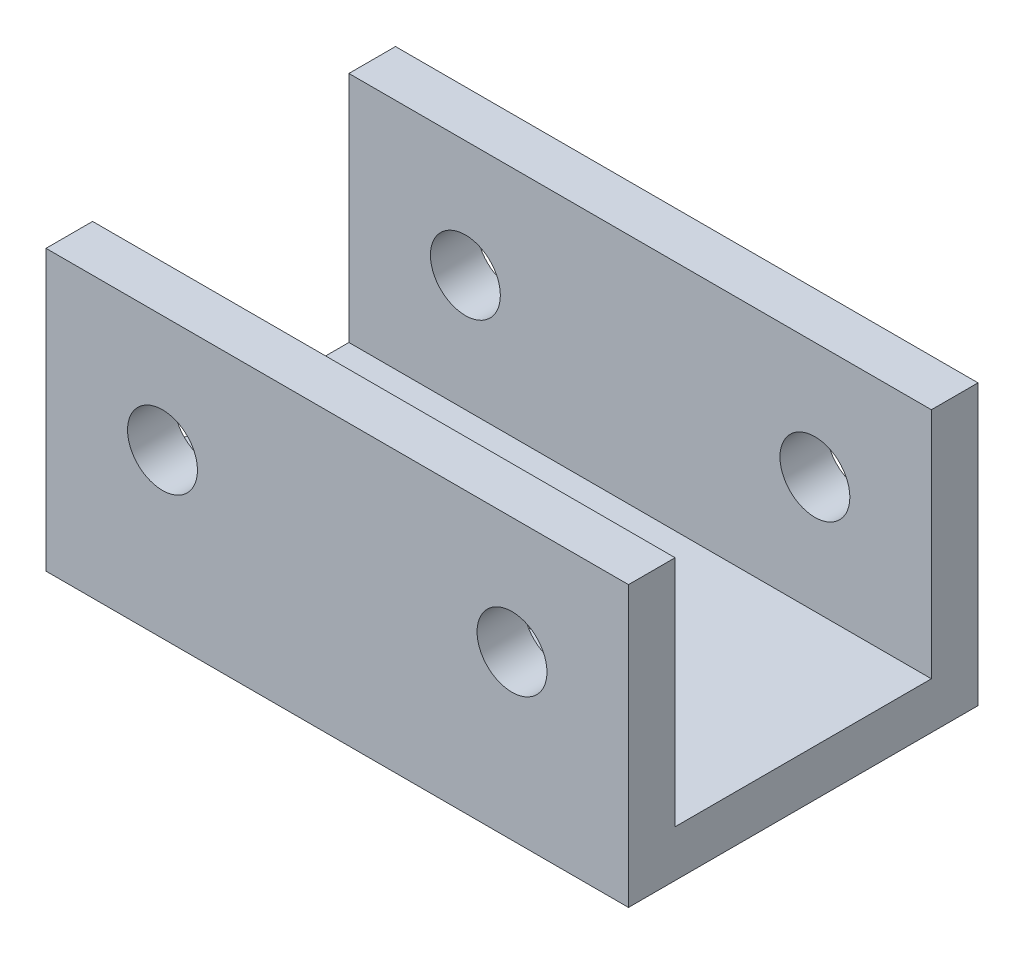
ISO-10303-21;
HEADER;
FILE_DESCRIPTION(('STEP AP214'),'2;1');
FILE_NAME('part.step','',(''),(''),'','','');
FILE_SCHEMA(('AUTOMOTIVE_DESIGN { 1 0 10303 214 1 1 1 1 }'));
ENDSEC;
DATA;
#1=APPLICATION_CONTEXT('core data for automotive mechanical design processes');
#2=APPLICATION_PROTOCOL_DEFINITION('international standard','automotive_design',2000,#1);
#3=PRODUCT_CONTEXT('',#1,'mechanical');
#4=PRODUCT('Part','Part','',(#3));
#5=PRODUCT_RELATED_PRODUCT_CATEGORY('part','',(#4));
#6=PRODUCT_DEFINITION_FORMATION('','',#4);
#7=PRODUCT_DEFINITION_CONTEXT('part definition',#1,'design');
#8=PRODUCT_DEFINITION('design','',#6,#7);
#9=PRODUCT_DEFINITION_SHAPE('','',#8);
#10=(LENGTH_UNIT() NAMED_UNIT(*) SI_UNIT(.MILLI.,.METRE.));
#11=(NAMED_UNIT(*) PLANE_ANGLE_UNIT() SI_UNIT($,.RADIAN.));
#12=(NAMED_UNIT(*) SI_UNIT($,.STERADIAN.) SOLID_ANGLE_UNIT());
#13=UNCERTAINTY_MEASURE_WITH_UNIT(LENGTH_MEASURE(1.E-05),#10,'distance_accuracy_value','');
#14=(GEOMETRIC_REPRESENTATION_CONTEXT(3) GLOBAL_UNCERTAINTY_ASSIGNED_CONTEXT((#13)) GLOBAL_UNIT_ASSIGNED_CONTEXT((#10,
#11,#12)) REPRESENTATION_CONTEXT('',''));
#15=CARTESIAN_POINT('',(0.,0.,0.));
#16=DIRECTION('',(0.,0.,1.));
#17=DIRECTION('',(1.,0.,0.));
#18=AXIS2_PLACEMENT_3D('',#15,#16,#17);
#19=CARTESIAN_POINT('',(0.,0.,0.));
#20=DIRECTION('',(0.,-1.,0.));
#21=DIRECTION('',(0.,0.,-1.));
#22=AXIS2_PLACEMENT_3D('',#19,#20,#21);
#23=PLANE('',#22);
#24=DIRECTION('',(0.,0.,1.));
#25=VECTOR('',#24,1.);
#26=CARTESIAN_POINT('',(-50.,0.,30.));
#27=LINE('',#26,#25);
#28=CARTESIAN_POINT('',(-50.,0.,-30.));
#29=VERTEX_POINT('',#28);
#30=CARTESIAN_POINT('',(-50.,0.,30.));
#31=VERTEX_POINT('',#30);
#32=EDGE_CURVE('E212',#29,#31,#27,.T.);
#33=ORIENTED_EDGE('',*,*,#32,.F.);
#34=DIRECTION('',(-1.,0.,0.));
#35=VECTOR('',#34,1.);
#36=CARTESIAN_POINT('',(-50.,0.,-30.));
#37=LINE('',#36,#35);
#38=CARTESIAN_POINT('',(50.,0.,-30.));
#39=VERTEX_POINT('',#38);
#40=EDGE_CURVE('E239',#39,#29,#37,.T.);
#41=ORIENTED_EDGE('',*,*,#40,.F.);
#42=DIRECTION('',(0.,0.,-1.));
#43=VECTOR('',#42,1.);
#44=CARTESIAN_POINT('',(50.,0.,-30.));
#45=LINE('',#44,#43);
#46=CARTESIAN_POINT('',(50.,0.,30.));
#47=VERTEX_POINT('',#46);
#48=EDGE_CURVE('E236',#47,#39,#45,.T.);
#49=ORIENTED_EDGE('',*,*,#48,.F.);
#50=DIRECTION('',(1.,0.,0.));
#51=VECTOR('',#50,1.);
#52=CARTESIAN_POINT('',(50.,0.,30.));
#53=LINE('',#52,#51);
#54=EDGE_CURVE('E233',#31,#47,#53,.T.);
#55=ORIENTED_EDGE('',*,*,#54,.F.);
#56=EDGE_LOOP('',(#33,#41,#49,#55));
#57=FACE_BOUND('',#56,.T.);
#58=DIRECTION('',(-1.,0.,0.));
#59=VECTOR('',#58,1.);
#60=CARTESIAN_POINT('',(-15.,0.,-5.));
#61=LINE('',#60,#59);
#62=CARTESIAN_POINT('',(15.,0.,-5.));
#63=VERTEX_POINT('',#62);
#64=CARTESIAN_POINT('',(-15.,0.,-5.));
#65=VERTEX_POINT('',#64);
#66=EDGE_CURVE('E163',#63,#65,#61,.T.);
#67=ORIENTED_EDGE('',*,*,#66,.T.);
#68=CARTESIAN_POINT('',(-15.,0.,0.));
#69=DIRECTION('',(0.,1.,0.));
#70=DIRECTION('',(0.,0.,-1.));
#71=AXIS2_PLACEMENT_3D('',#68,#69,#70);
#72=CIRCLE('',#71,5.);
#73=CARTESIAN_POINT('',(-15.,0.,5.));
#74=VERTEX_POINT('',#73);
#75=EDGE_CURVE('E70',#65,#74,#72,.T.);
#76=ORIENTED_EDGE('',*,*,#75,.T.);
#77=DIRECTION('',(1.,0.,0.));
#78=VECTOR('',#77,1.);
#79=CARTESIAN_POINT('',(15.,0.,5.));
#80=LINE('',#79,#78);
#81=CARTESIAN_POINT('',(15.,0.,5.));
#82=VERTEX_POINT('',#81);
#83=EDGE_CURVE('E153',#74,#82,#80,.T.);
#84=ORIENTED_EDGE('',*,*,#83,.T.);
#85=CARTESIAN_POINT('',(15.,0.,0.));
#86=DIRECTION('',(0.,1.,0.));
#87=DIRECTION('',(0.,0.,-1.));
#88=AXIS2_PLACEMENT_3D('',#85,#86,#87);
#89=CIRCLE('',#88,5.);
#90=EDGE_CURVE('E160',#82,#63,#89,.T.);
#91=ORIENTED_EDGE('',*,*,#90,.T.);
#92=EDGE_LOOP('',(#67,#76,#84,#91));
#93=FACE_BOUND('',#92,.T.);
#94=ADVANCED_FACE('F51',(#57,#93),#23,.T.);
#95=CARTESIAN_POINT('',(0.,8.,0.));
#96=DIRECTION('',(0.,-1.,0.));
#97=DIRECTION('',(0.,0.,-1.));
#98=AXIS2_PLACEMENT_3D('',#95,#96,#97);
#99=PLANE('',#98);
#100=DIRECTION('',(1.,0.,0.));
#101=VECTOR('',#100,1.);
#102=CARTESIAN_POINT('',(52.,8.,22.));
#103=LINE('',#102,#101);
#104=CARTESIAN_POINT('',(-50.,8.,22.));
#105=VERTEX_POINT('',#104);
#106=CARTESIAN_POINT('',(50.,8.,22.));
#107=VERTEX_POINT('',#106);
#108=EDGE_CURVE('E149',#105,#107,#103,.T.);
#109=ORIENTED_EDGE('',*,*,#108,.T.);
#110=DIRECTION('',(0.,0.,1.));
#111=VECTOR('',#110,1.);
#112=CARTESIAN_POINT('',(50.,8.,-30.));
#113=LINE('',#112,#111);
#114=CARTESIAN_POINT('',(50.,8.,-22.));
#115=VERTEX_POINT('',#114);
#116=EDGE_CURVE('E265',#115,#107,#113,.T.);
#117=ORIENTED_EDGE('',*,*,#116,.F.);
#118=DIRECTION('',(-1.,0.,0.));
#119=VECTOR('',#118,1.);
#120=CARTESIAN_POINT('',(-52.,8.,-22.));
#121=LINE('',#120,#119);
#122=CARTESIAN_POINT('',(-50.,8.,-22.));
#123=VERTEX_POINT('',#122);
#124=EDGE_CURVE('E188',#115,#123,#121,.T.);
#125=ORIENTED_EDGE('',*,*,#124,.T.);
#126=DIRECTION('',(0.,0.,-1.));
#127=VECTOR('',#126,1.);
#128=CARTESIAN_POINT('',(-50.,8.,30.));
#129=LINE('',#128,#127);
#130=EDGE_CURVE('E208',#105,#123,#129,.T.);
#131=ORIENTED_EDGE('',*,*,#130,.F.);
#132=EDGE_LOOP('',(#109,#117,#125,#131));
#133=FACE_BOUND('',#132,.T.);
#134=CARTESIAN_POINT('',(-15.,8.,0.));
#135=DIRECTION('',(0.,-1.,0.));
#136=DIRECTION('',(0.,0.,-1.));
#137=AXIS2_PLACEMENT_3D('',#134,#135,#136);
#138=CIRCLE('',#137,5.);
#139=CARTESIAN_POINT('',(-15.,8.,-5.));
#140=VERTEX_POINT('',#139);
#141=CARTESIAN_POINT('',(-15.,8.,5.));
#142=VERTEX_POINT('',#141);
#143=EDGE_CURVE('E11',#140,#142,#138,.F.);
#144=ORIENTED_EDGE('',*,*,#143,.F.);
#145=DIRECTION('',(-1.,0.,0.));
#146=VECTOR('',#145,1.);
#147=CARTESIAN_POINT('',(0.,8.,-5.));
#148=LINE('',#147,#146);
#149=CARTESIAN_POINT('',(15.,8.,-5.));
#150=VERTEX_POINT('',#149);
#151=EDGE_CURVE('E269',#150,#140,#148,.T.);
#152=ORIENTED_EDGE('',*,*,#151,.F.);
#153=CARTESIAN_POINT('',(15.,8.,0.));
#154=DIRECTION('',(0.,-1.,0.));
#155=DIRECTION('',(0.,0.,-1.));
#156=AXIS2_PLACEMENT_3D('',#153,#154,#155);
#157=CIRCLE('',#156,5.);
#158=CARTESIAN_POINT('',(15.,8.,5.));
#159=VERTEX_POINT('',#158);
#160=EDGE_CURVE('E271',#159,#150,#157,.F.);
#161=ORIENTED_EDGE('',*,*,#160,.F.);
#162=DIRECTION('',(1.,0.,0.));
#163=VECTOR('',#162,1.);
#164=CARTESIAN_POINT('',(0.,8.,5.));
#165=LINE('',#164,#163);
#166=EDGE_CURVE('E62',#142,#159,#165,.T.);
#167=ORIENTED_EDGE('',*,*,#166,.F.);
#168=EDGE_LOOP('',(#144,#152,#161,#167));
#169=FACE_BOUND('',#168,.T.);
#170=ADVANCED_FACE('F322',(#133,#169),#99,.F.);
#171=CARTESIAN_POINT('',(0.,48.,0.));
#172=DIRECTION('',(0.,-1.,0.));
#173=DIRECTION('',(0.,0.,-1.));
#174=AXIS2_PLACEMENT_3D('',#171,#172,#173);
#175=PLANE('',#174);
#176=DIRECTION('',(0.,0.,1.));
#177=VECTOR('',#176,1.);
#178=CARTESIAN_POINT('',(-50.,48.,30.));
#179=LINE('',#178,#177);
#180=CARTESIAN_POINT('',(-50.,48.,-30.));
#181=VERTEX_POINT('',#180);
#182=CARTESIAN_POINT('',(-50.,48.,-22.));
#183=VERTEX_POINT('',#182);
#184=EDGE_CURVE('E213',#181,#183,#179,.T.);
#185=ORIENTED_EDGE('',*,*,#184,.T.);
#186=DIRECTION('',(1.,0.,0.));
#187=VECTOR('',#186,1.);
#188=CARTESIAN_POINT('',(0.,48.,-22.));
#189=LINE('',#188,#187);
#190=CARTESIAN_POINT('',(50.,48.,-22.));
#191=VERTEX_POINT('',#190);
#192=EDGE_CURVE('E261',#183,#191,#189,.T.);
#193=ORIENTED_EDGE('',*,*,#192,.T.);
#194=DIRECTION('',(0.,0.,-1.));
#195=VECTOR('',#194,1.);
#196=CARTESIAN_POINT('',(50.,48.,-30.));
#197=LINE('',#196,#195);
#198=CARTESIAN_POINT('',(50.,48.,-30.));
#199=VERTEX_POINT('',#198);
#200=EDGE_CURVE('E221',#191,#199,#197,.T.);
#201=ORIENTED_EDGE('',*,*,#200,.T.);
#202=DIRECTION('',(-1.,0.,0.));
#203=VECTOR('',#202,1.);
#204=CARTESIAN_POINT('',(-50.,48.,-30.));
#205=LINE('',#204,#203);
#206=EDGE_CURVE('E226',#199,#181,#205,.T.);
#207=ORIENTED_EDGE('',*,*,#206,.T.);
#208=EDGE_LOOP('',(#185,#193,#201,#207));
#209=FACE_BOUND('',#208,.T.);
#210=ADVANCED_FACE('F327',(#209),#175,.F.);
#211=CARTESIAN_POINT('',(-50.,48.,30.));
#212=DIRECTION('',(1.,0.,0.));
#213=DIRECTION('',(0.,0.,-1.));
#214=AXIS2_PLACEMENT_3D('',#211,#212,#213);
#215=PLANE('',#214);
#216=ORIENTED_EDGE('',*,*,#130,.T.);
#217=DIRECTION('',(0.,1.,0.));
#218=VECTOR('',#217,1.);
#219=CARTESIAN_POINT('',(-50.,48.,-22.));
#220=LINE('',#219,#218);
#221=EDGE_CURVE('E204',#123,#183,#220,.T.);
#222=ORIENTED_EDGE('',*,*,#221,.T.);
#223=ORIENTED_EDGE('',*,*,#184,.F.);
#224=DIRECTION('',(0.,-1.,0.));
#225=VECTOR('',#224,1.);
#226=CARTESIAN_POINT('',(-50.,48.,-30.));
#227=LINE('',#226,#225);
#228=EDGE_CURVE('E229',#181,#29,#227,.T.);
#229=ORIENTED_EDGE('',*,*,#228,.T.);
#230=ORIENTED_EDGE('',*,*,#32,.T.);
#231=DIRECTION('',(0.,-1.,0.));
#232=VECTOR('',#231,1.);
#233=CARTESIAN_POINT('',(-50.,48.,30.));
#234=LINE('',#233,#232);
#235=CARTESIAN_POINT('',(-50.,48.,30.));
#236=VERTEX_POINT('',#235);
#237=EDGE_CURVE('E253',#236,#31,#234,.T.);
#238=ORIENTED_EDGE('',*,*,#237,.F.);
#239=CARTESIAN_POINT('',(-50.,48.,22.));
#240=VERTEX_POINT('',#239);
#241=EDGE_CURVE('E218',#240,#236,#179,.T.);
#242=ORIENTED_EDGE('',*,*,#241,.F.);
#243=DIRECTION('',(0.,-1.,0.));
#244=VECTOR('',#243,1.);
#245=CARTESIAN_POINT('',(-50.,48.,22.));
#246=LINE('',#245,#244);
#247=EDGE_CURVE('E196',#240,#105,#246,.T.);
#248=ORIENTED_EDGE('',*,*,#247,.T.);
#249=EDGE_LOOP('',(#216,#222,#223,#229,#230,#238,#242,#248));
#250=FACE_BOUND('',#249,.T.);
#251=ADVANCED_FACE('F54',(#250),#215,.F.);
#252=CARTESIAN_POINT('',(50.,48.,30.));
#253=DIRECTION('',(0.,0.,-1.));
#254=DIRECTION('',(-1.,0.,0.));
#255=AXIS2_PLACEMENT_3D('',#252,#253,#254);
#256=PLANE('',#255);
#257=CARTESIAN_POINT('',(-30.,28.,30.));
#258=DIRECTION('',(0.,0.,-1.));
#259=DIRECTION('',(-1.,0.,0.));
#260=AXIS2_PLACEMENT_3D('',#257,#258,#259);
#261=CIRCLE('',#260,6.);
#262=CARTESIAN_POINT('',(-36.,28.,30.));
#263=VERTEX_POINT('',#262);
#264=EDGE_CURVE('E165',#263,#263,#261,.T.);
#265=ORIENTED_EDGE('',*,*,#264,.T.);
#266=EDGE_LOOP('',(#265));
#267=FACE_BOUND('',#266,.T.);
#268=CARTESIAN_POINT('',(30.,28.,30.));
#269=DIRECTION('',(0.,0.,-1.));
#270=DIRECTION('',(-1.,0.,0.));
#271=AXIS2_PLACEMENT_3D('',#268,#269,#270);
#272=CIRCLE('',#271,6.);
#273=CARTESIAN_POINT('',(24.,28.,30.));
#274=VERTEX_POINT('',#273);
#275=EDGE_CURVE('E289',#274,#274,#272,.T.);
#276=ORIENTED_EDGE('',*,*,#275,.T.);
#277=EDGE_LOOP('',(#276));
#278=FACE_BOUND('',#277,.T.);
#279=ORIENTED_EDGE('',*,*,#54,.T.);
#280=DIRECTION('',(0.,-1.,0.));
#281=VECTOR('',#280,1.);
#282=CARTESIAN_POINT('',(50.,48.,30.));
#283=LINE('',#282,#281);
#284=CARTESIAN_POINT('',(50.,48.,30.));
#285=VERTEX_POINT('',#284);
#286=EDGE_CURVE('E249',#285,#47,#283,.T.);
#287=ORIENTED_EDGE('',*,*,#286,.F.);
#288=DIRECTION('',(1.,0.,0.));
#289=VECTOR('',#288,1.);
#290=CARTESIAN_POINT('',(50.,48.,30.));
#291=LINE('',#290,#289);
#292=EDGE_CURVE('E217',#236,#285,#291,.T.);
#293=ORIENTED_EDGE('',*,*,#292,.F.);
#294=ORIENTED_EDGE('',*,*,#237,.T.);
#295=EDGE_LOOP('',(#279,#287,#293,#294));
#296=FACE_BOUND('',#295,.T.);
#297=ADVANCED_FACE('F346',(#267,#278,#296),#256,.F.);
#298=CARTESIAN_POINT('',(50.,48.,-30.));
#299=DIRECTION('',(-1.,0.,0.));
#300=DIRECTION('',(0.,0.,1.));
#301=AXIS2_PLACEMENT_3D('',#298,#299,#300);
#302=PLANE('',#301);
#303=ORIENTED_EDGE('',*,*,#200,.F.);
#304=DIRECTION('',(0.,-1.,0.));
#305=VECTOR('',#304,1.);
#306=CARTESIAN_POINT('',(50.,48.,-22.));
#307=LINE('',#306,#305);
#308=EDGE_CURVE('E200',#191,#115,#307,.T.);
#309=ORIENTED_EDGE('',*,*,#308,.T.);
#310=ORIENTED_EDGE('',*,*,#116,.T.);
#311=DIRECTION('',(0.,1.,0.));
#312=VECTOR('',#311,1.);
#313=CARTESIAN_POINT('',(50.,48.,22.));
#314=LINE('',#313,#312);
#315=CARTESIAN_POINT('',(50.,48.,22.));
#316=VERTEX_POINT('',#315);
#317=EDGE_CURVE('E192',#107,#316,#314,.T.);
#318=ORIENTED_EDGE('',*,*,#317,.T.);
#319=EDGE_CURVE('E222',#285,#316,#197,.T.);
#320=ORIENTED_EDGE('',*,*,#319,.F.);
#321=ORIENTED_EDGE('',*,*,#286,.T.);
#322=ORIENTED_EDGE('',*,*,#48,.T.);
#323=DIRECTION('',(0.,-1.,0.));
#324=VECTOR('',#323,1.);
#325=CARTESIAN_POINT('',(50.,48.,-30.));
#326=LINE('',#325,#324);
#327=EDGE_CURVE('E245',#199,#39,#326,.T.);
#328=ORIENTED_EDGE('',*,*,#327,.F.);
#329=EDGE_LOOP('',(#303,#309,#310,#318,#320,#321,#322,#328));
#330=FACE_BOUND('',#329,.T.);
#331=ADVANCED_FACE('F343',(#330),#302,.F.);
#332=CARTESIAN_POINT('',(-50.,48.,-30.));
#333=DIRECTION('',(0.,0.,1.));
#334=DIRECTION('',(1.,0.,0.));
#335=AXIS2_PLACEMENT_3D('',#332,#333,#334);
#336=PLANE('',#335);
#337=CARTESIAN_POINT('',(-30.,28.,-30.));
#338=DIRECTION('',(0.,0.,1.));
#339=DIRECTION('',(1.,0.,0.));
#340=AXIS2_PLACEMENT_3D('',#337,#338,#339);
#341=CIRCLE('',#340,6.);
#342=CARTESIAN_POINT('',(-24.,28.,-30.));
#343=VERTEX_POINT('',#342);
#344=EDGE_CURVE('E170',#343,#343,#341,.T.);
#345=ORIENTED_EDGE('',*,*,#344,.T.);
#346=EDGE_LOOP('',(#345));
#347=FACE_BOUND('',#346,.T.);
#348=CARTESIAN_POINT('',(30.,28.,-30.));
#349=DIRECTION('',(0.,0.,1.));
#350=DIRECTION('',(1.,0.,0.));
#351=AXIS2_PLACEMENT_3D('',#348,#349,#350);
#352=CIRCLE('',#351,6.);
#353=CARTESIAN_POINT('',(36.,28.,-30.));
#354=VERTEX_POINT('',#353);
#355=EDGE_CURVE('E283',#354,#354,#352,.T.);
#356=ORIENTED_EDGE('',*,*,#355,.T.);
#357=EDGE_LOOP('',(#356));
#358=FACE_BOUND('',#357,.T.);
#359=ORIENTED_EDGE('',*,*,#40,.T.);
#360=ORIENTED_EDGE('',*,*,#228,.F.);
#361=ORIENTED_EDGE('',*,*,#206,.F.);
#362=ORIENTED_EDGE('',*,*,#327,.T.);
#363=EDGE_LOOP('',(#359,#360,#361,#362));
#364=FACE_BOUND('',#363,.T.);
#365=ADVANCED_FACE('F303',(#347,#358,#364),#336,.F.);
#366=ORIENTED_EDGE('',*,*,#319,.T.);
#367=DIRECTION('',(-1.,0.,0.));
#368=VECTOR('',#367,1.);
#369=CARTESIAN_POINT('',(0.,48.,22.));
#370=LINE('',#369,#368);
#371=EDGE_CURVE('E257',#316,#240,#370,.T.);
#372=ORIENTED_EDGE('',*,*,#371,.T.);
#373=ORIENTED_EDGE('',*,*,#241,.T.);
#374=ORIENTED_EDGE('',*,*,#292,.T.);
#375=EDGE_LOOP('',(#366,#372,#373,#374));
#376=FACE_BOUND('',#375,.T.);
#377=ADVANCED_FACE('F336',(#376),#175,.F.);
#378=CARTESIAN_POINT('',(-52.,8.,-22.));
#379=DIRECTION('',(0.,0.,-1.));
#380=DIRECTION('',(-1.,0.,0.));
#381=AXIS2_PLACEMENT_3D('',#378,#379,#380);
#382=PLANE('',#381);
#383=CARTESIAN_POINT('',(-30.,28.,-22.));
#384=DIRECTION('',(0.,0.,-1.));
#385=DIRECTION('',(-1.,0.,0.));
#386=AXIS2_PLACEMENT_3D('',#383,#384,#385);
#387=CIRCLE('',#386,6.);
#388=CARTESIAN_POINT('',(-36.,28.,-22.));
#389=VERTEX_POINT('',#388);
#390=EDGE_CURVE('E295',#389,#389,#387,.T.);
#391=ORIENTED_EDGE('',*,*,#390,.T.);
#392=EDGE_LOOP('',(#391));
#393=FACE_BOUND('',#392,.T.);
#394=CARTESIAN_POINT('',(30.,28.,-22.));
#395=DIRECTION('',(0.,0.,-1.));
#396=DIRECTION('',(-1.,0.,0.));
#397=AXIS2_PLACEMENT_3D('',#394,#395,#396);
#398=CIRCLE('',#397,6.);
#399=CARTESIAN_POINT('',(24.,28.,-22.));
#400=VERTEX_POINT('',#399);
#401=EDGE_CURVE('E278',#400,#400,#398,.T.);
#402=ORIENTED_EDGE('',*,*,#401,.T.);
#403=EDGE_LOOP('',(#402));
#404=FACE_BOUND('',#403,.T.);
#405=ORIENTED_EDGE('',*,*,#124,.F.);
#406=ORIENTED_EDGE('',*,*,#308,.F.);
#407=ORIENTED_EDGE('',*,*,#192,.F.);
#408=ORIENTED_EDGE('',*,*,#221,.F.);
#409=EDGE_LOOP('',(#405,#406,#407,#408));
#410=FACE_BOUND('',#409,.T.);
#411=ADVANCED_FACE('F373',(#393,#404,#410),#382,.F.);
#412=CARTESIAN_POINT('',(52.,8.,22.));
#413=DIRECTION('',(0.,0.,1.));
#414=DIRECTION('',(1.,0.,0.));
#415=AXIS2_PLACEMENT_3D('',#412,#413,#414);
#416=PLANE('',#415);
#417=CARTESIAN_POINT('',(-30.,28.,22.));
#418=DIRECTION('',(0.,0.,1.));
#419=DIRECTION('',(1.,0.,0.));
#420=AXIS2_PLACEMENT_3D('',#417,#418,#419);
#421=CIRCLE('',#420,6.);
#422=CARTESIAN_POINT('',(-24.,28.,22.));
#423=VERTEX_POINT('',#422);
#424=EDGE_CURVE('E56',#423,#423,#421,.T.);
#425=ORIENTED_EDGE('',*,*,#424,.T.);
#426=EDGE_LOOP('',(#425));
#427=FACE_BOUND('',#426,.T.);
#428=CARTESIAN_POINT('',(30.,28.,22.));
#429=DIRECTION('',(0.,0.,1.));
#430=DIRECTION('',(1.,0.,0.));
#431=AXIS2_PLACEMENT_3D('',#428,#429,#430);
#432=CIRCLE('',#431,6.);
#433=CARTESIAN_POINT('',(36.,28.,22.));
#434=VERTEX_POINT('',#433);
#435=EDGE_CURVE('E275',#434,#434,#432,.T.);
#436=ORIENTED_EDGE('',*,*,#435,.T.);
#437=EDGE_LOOP('',(#436));
#438=FACE_BOUND('',#437,.T.);
#439=ORIENTED_EDGE('',*,*,#371,.F.);
#440=ORIENTED_EDGE('',*,*,#317,.F.);
#441=ORIENTED_EDGE('',*,*,#108,.F.);
#442=ORIENTED_EDGE('',*,*,#247,.F.);
#443=EDGE_LOOP('',(#439,#440,#441,#442));
#444=FACE_BOUND('',#443,.T.);
#445=ADVANCED_FACE('F378',(#427,#438,#444),#416,.F.);
#446=CARTESIAN_POINT('',(-15.,48.,0.));
#447=DIRECTION('',(0.,-1.,0.));
#448=DIRECTION('',(0.,0.,-1.));
#449=AXIS2_PLACEMENT_3D('',#446,#447,#448);
#450=CYLINDRICAL_SURFACE('',#449,5.);
#451=ORIENTED_EDGE('',*,*,#143,.T.);
#452=DIRECTION('',(0.,-1.,0.));
#453=VECTOR('',#452,1.);
#454=CARTESIAN_POINT('',(-15.,48.,5.));
#455=LINE('',#454,#453);
#456=EDGE_CURVE('E142',#142,#74,#455,.T.);
#457=ORIENTED_EDGE('',*,*,#456,.T.);
#458=ORIENTED_EDGE('',*,*,#75,.F.);
#459=DIRECTION('',(0.,-1.,0.));
#460=VECTOR('',#459,1.);
#461=CARTESIAN_POINT('',(-15.,48.,-5.));
#462=LINE('',#461,#460);
#463=EDGE_CURVE('E178',#140,#65,#462,.T.);
#464=ORIENTED_EDGE('',*,*,#463,.F.);
#465=EDGE_LOOP('',(#451,#457,#458,#464));
#466=FACE_BOUND('',#465,.T.);
#467=ADVANCED_FACE('F144',(#466),#450,.F.);
#468=CARTESIAN_POINT('',(15.,48.,5.));
#469=DIRECTION('',(0.,0.,-1.));
#470=DIRECTION('',(-1.,0.,0.));
#471=AXIS2_PLACEMENT_3D('',#468,#469,#470);
#472=PLANE('',#471);
#473=ORIENTED_EDGE('',*,*,#166,.T.);
#474=DIRECTION('',(0.,-1.,0.));
#475=VECTOR('',#474,1.);
#476=CARTESIAN_POINT('',(15.,48.,5.));
#477=LINE('',#476,#475);
#478=EDGE_CURVE('E150',#159,#82,#477,.T.);
#479=ORIENTED_EDGE('',*,*,#478,.T.);
#480=ORIENTED_EDGE('',*,*,#83,.F.);
#481=ORIENTED_EDGE('',*,*,#456,.F.);
#482=EDGE_LOOP('',(#473,#479,#480,#481));
#483=FACE_BOUND('',#482,.T.);
#484=ADVANCED_FACE('F154',(#483),#472,.T.);
#485=CARTESIAN_POINT('',(15.,48.,0.));
#486=DIRECTION('',(0.,-1.,0.));
#487=DIRECTION('',(0.,0.,-1.));
#488=AXIS2_PLACEMENT_3D('',#485,#486,#487);
#489=CYLINDRICAL_SURFACE('',#488,5.);
#490=ORIENTED_EDGE('',*,*,#160,.T.);
#491=DIRECTION('',(0.,-1.,0.));
#492=VECTOR('',#491,1.);
#493=CARTESIAN_POINT('',(15.,48.,-5.));
#494=LINE('',#493,#492);
#495=EDGE_CURVE('E78',#150,#63,#494,.T.);
#496=ORIENTED_EDGE('',*,*,#495,.T.);
#497=ORIENTED_EDGE('',*,*,#90,.F.);
#498=ORIENTED_EDGE('',*,*,#478,.F.);
#499=EDGE_LOOP('',(#490,#496,#497,#498));
#500=FACE_BOUND('',#499,.T.);
#501=ADVANCED_FACE('F432',(#500),#489,.F.);
#502=CARTESIAN_POINT('',(-15.,48.,-5.));
#503=DIRECTION('',(0.,0.,1.));
#504=DIRECTION('',(1.,0.,0.));
#505=AXIS2_PLACEMENT_3D('',#502,#503,#504);
#506=PLANE('',#505);
#507=ORIENTED_EDGE('',*,*,#151,.T.);
#508=ORIENTED_EDGE('',*,*,#463,.T.);
#509=ORIENTED_EDGE('',*,*,#66,.F.);
#510=ORIENTED_EDGE('',*,*,#495,.F.);
#511=EDGE_LOOP('',(#507,#508,#509,#510));
#512=FACE_BOUND('',#511,.T.);
#513=ADVANCED_FACE('F439',(#512),#506,.T.);
#514=CARTESIAN_POINT('',(30.,28.,-71.));
#515=DIRECTION('',(0.,0.,1.));
#516=DIRECTION('',(1.,0.,0.));
#517=AXIS2_PLACEMENT_3D('',#514,#515,#516);
#518=CYLINDRICAL_SURFACE('',#517,6.);
#519=ORIENTED_EDGE('',*,*,#435,.F.);
#520=EDGE_LOOP('',(#519));
#521=FACE_BOUND('',#520,.T.);
#522=ORIENTED_EDGE('',*,*,#275,.F.);
#523=EDGE_LOOP('',(#522));
#524=FACE_BOUND('',#523,.T.);
#525=ADVANCED_FACE('F316',(#521,#524),#518,.F.);
#526=CARTESIAN_POINT('',(-30.,28.,-71.));
#527=DIRECTION('',(0.,0.,1.));
#528=DIRECTION('',(1.,0.,0.));
#529=AXIS2_PLACEMENT_3D('',#526,#527,#528);
#530=CYLINDRICAL_SURFACE('',#529,6.);
#531=ORIENTED_EDGE('',*,*,#424,.F.);
#532=EDGE_LOOP('',(#531));
#533=FACE_BOUND('',#532,.T.);
#534=ORIENTED_EDGE('',*,*,#264,.F.);
#535=EDGE_LOOP('',(#534));
#536=FACE_BOUND('',#535,.T.);
#537=ADVANCED_FACE('F311',(#533,#536),#530,.F.);
#538=ORIENTED_EDGE('',*,*,#401,.F.);
#539=EDGE_LOOP('',(#538));
#540=FACE_BOUND('',#539,.T.);
#541=ORIENTED_EDGE('',*,*,#355,.F.);
#542=EDGE_LOOP('',(#541));
#543=FACE_BOUND('',#542,.T.);
#544=ADVANCED_FACE('F308',(#540,#543),#518,.F.);
#545=ORIENTED_EDGE('',*,*,#390,.F.);
#546=EDGE_LOOP('',(#545));
#547=FACE_BOUND('',#546,.T.);
#548=ORIENTED_EDGE('',*,*,#344,.F.);
#549=EDGE_LOOP('',(#548));
#550=FACE_BOUND('',#549,.T.);
#551=ADVANCED_FACE('F306',(#547,#550),#530,.F.);
#552=CLOSED_SHELL('',(#94,#170,#210,#251,#297,#331,#365,#377,#411,#445,#467,#484,#501,#513,#525,
#537,#544,#551));
#553=MANIFOLD_SOLID_BREP('B2',#552);
#554=ADVANCED_BREP_SHAPE_REPRESENTATION('',(#18,#553),#14);
#555=SHAPE_DEFINITION_REPRESENTATION(#9,#554);
ENDSEC;
END-ISO-10303-21;
